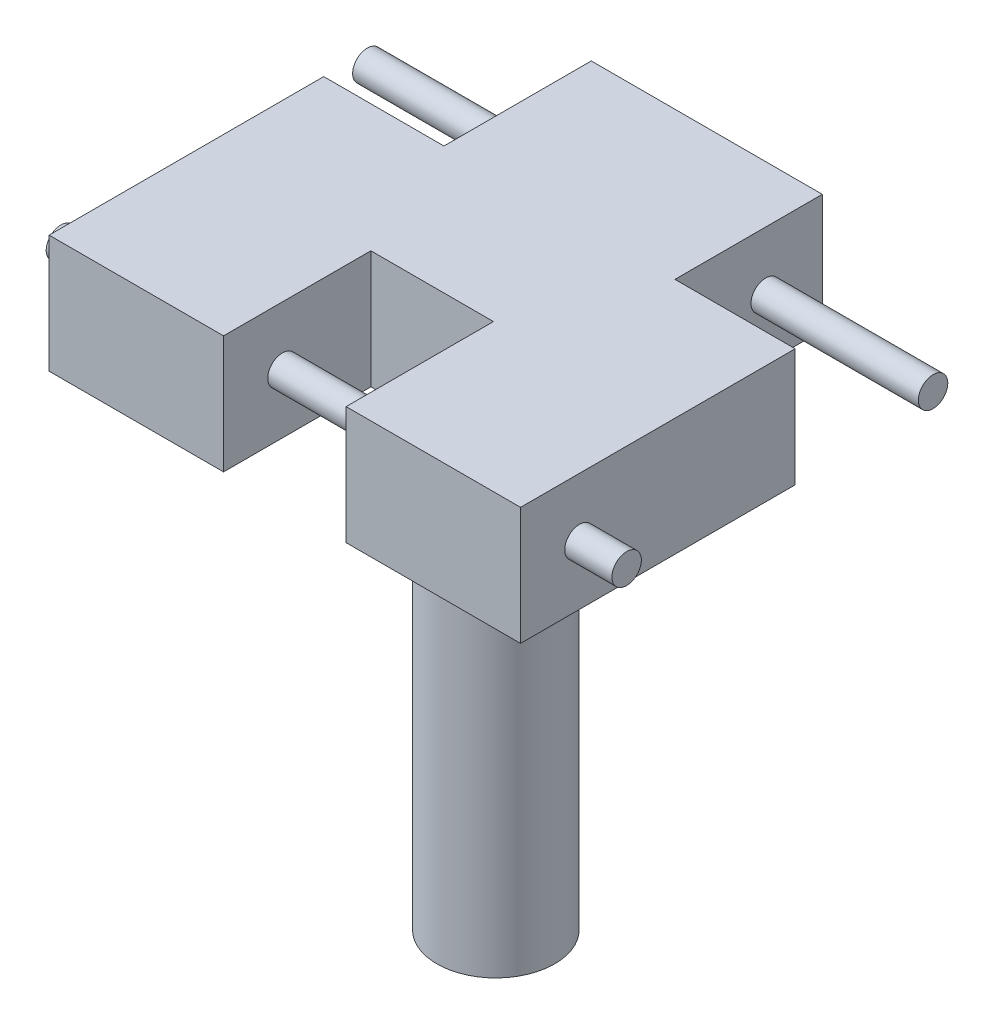
ISO-10303-21;
HEADER;
FILE_DESCRIPTION(('STEP AP214'),'2;1');
FILE_NAME('part.step','',(''),(''),'','','');
FILE_SCHEMA(('AUTOMOTIVE_DESIGN { 1 0 10303 214 1 1 1 1 }'));
ENDSEC;
DATA;
#1=APPLICATION_CONTEXT('core data for automotive mechanical design processes');
#2=APPLICATION_PROTOCOL_DEFINITION('international standard','automotive_design',2000,#1);
#3=PRODUCT_CONTEXT('',#1,'mechanical');
#4=PRODUCT('Part','Part','',(#3));
#5=PRODUCT_RELATED_PRODUCT_CATEGORY('part','',(#4));
#6=PRODUCT_DEFINITION_FORMATION('','',#4);
#7=PRODUCT_DEFINITION_CONTEXT('part definition',#1,'design');
#8=PRODUCT_DEFINITION('design','',#6,#7);
#9=PRODUCT_DEFINITION_SHAPE('','',#8);
#10=(LENGTH_UNIT() NAMED_UNIT(*) SI_UNIT(.MILLI.,.METRE.));
#11=(NAMED_UNIT(*) PLANE_ANGLE_UNIT() SI_UNIT($,.RADIAN.));
#12=(NAMED_UNIT(*) SI_UNIT($,.STERADIAN.) SOLID_ANGLE_UNIT());
#13=UNCERTAINTY_MEASURE_WITH_UNIT(LENGTH_MEASURE(1.E-05),#10,'distance_accuracy_value','');
#14=(GEOMETRIC_REPRESENTATION_CONTEXT(3) GLOBAL_UNCERTAINTY_ASSIGNED_CONTEXT((#13)) GLOBAL_UNIT_ASSIGNED_CONTEXT((#10,
#11,#12)) REPRESENTATION_CONTEXT('',''));
#15=CARTESIAN_POINT('',(0.,0.,0.));
#16=DIRECTION('',(0.,0.,1.));
#17=DIRECTION('',(1.,0.,0.));
#18=AXIS2_PLACEMENT_3D('',#15,#16,#17);
#19=CARTESIAN_POINT('',(-6.223,6.35,1.7145));
#20=DIRECTION('',(1.,0.,0.));
#21=DIRECTION('',(0.,0.,-1.));
#22=AXIS2_PLACEMENT_3D('',#19,#20,#21);
#23=PLANE('',#22);
#24=CARTESIAN_POINT('',(-6.223,3.175,-3.17499999999999));
#25=DIRECTION('',(1.,0.,0.));
#26=DIRECTION('',(0.,0.,-1.));
#27=AXIS2_PLACEMENT_3D('',#24,#25,#26);
#28=CIRCLE('',#27,0.79375);
#29=CARTESIAN_POINT('',(-6.223,3.175,-3.96874999999999));
#30=VERTEX_POINT('',#29);
#31=EDGE_CURVE('E218',#30,#30,#28,.T.);
#32=ORIENTED_EDGE('',*,*,#31,.T.);
#33=EDGE_LOOP('',(#32));
#34=FACE_BOUND('',#33,.T.);
#35=DIRECTION('',(0.,0.,1.));
#36=VECTOR('',#35,1.);
#37=CARTESIAN_POINT('',(-6.223,0.,1.7145));
#38=LINE('',#37,#36);
#39=CARTESIAN_POINT('',(-6.223,0.,-6.223));
#40=VERTEX_POINT('',#39);
#41=CARTESIAN_POINT('',(-6.223,0.,1.7145));
#42=VERTEX_POINT('',#41);
#43=EDGE_CURVE('E157',#40,#42,#38,.T.);
#44=ORIENTED_EDGE('',*,*,#43,.T.);
#45=DIRECTION('',(0.,-1.,0.));
#46=VECTOR('',#45,1.);
#47=CARTESIAN_POINT('',(-6.223,6.35,1.7145));
#48=LINE('',#47,#46);
#49=CARTESIAN_POINT('',(-6.223,6.35,1.7145));
#50=VERTEX_POINT('',#49);
#51=EDGE_CURVE('E11',#50,#42,#48,.T.);
#52=ORIENTED_EDGE('',*,*,#51,.F.);
#53=DIRECTION('',(0.,0.,1.));
#54=VECTOR('',#53,1.);
#55=CARTESIAN_POINT('',(-6.223,6.35,1.7145));
#56=LINE('',#55,#54);
#57=CARTESIAN_POINT('',(-6.223,6.35,-6.223));
#58=VERTEX_POINT('',#57);
#59=EDGE_CURVE('E180',#58,#50,#56,.T.);
#60=ORIENTED_EDGE('',*,*,#59,.F.);
#61=DIRECTION('',(0.,-1.,0.));
#62=VECTOR('',#61,1.);
#63=CARTESIAN_POINT('',(-6.223,6.35,-6.223));
#64=LINE('',#63,#62);
#65=EDGE_CURVE('E153',#58,#40,#64,.T.);
#66=ORIENTED_EDGE('',*,*,#65,.T.);
#67=EDGE_LOOP('',(#44,#52,#60,#66));
#68=FACE_BOUND('',#67,.T.);
#69=ADVANCED_FACE('F35',(#34,#68),#23,.F.);
#70=CARTESIAN_POINT('',(-12.7,6.35,1.7145));
#71=DIRECTION('',(0.,0.,1.));
#72=DIRECTION('',(1.,0.,0.));
#73=AXIS2_PLACEMENT_3D('',#70,#71,#72);
#74=PLANE('',#73);
#75=DIRECTION('',(-1.,0.,0.));
#76=VECTOR('',#75,1.);
#77=CARTESIAN_POINT('',(-12.7,0.,1.7145));
#78=LINE('',#77,#76);
#79=CARTESIAN_POINT('',(-12.7,0.,1.7145));
#80=VERTEX_POINT('',#79);
#81=EDGE_CURVE('E160',#42,#80,#78,.T.);
#82=ORIENTED_EDGE('',*,*,#81,.T.);
#83=DIRECTION('',(0.,-1.,0.));
#84=VECTOR('',#83,1.);
#85=CARTESIAN_POINT('',(-12.7,6.35,1.7145));
#86=LINE('',#85,#84);
#87=CARTESIAN_POINT('',(-12.7,6.35,1.7145));
#88=VERTEX_POINT('',#87);
#89=EDGE_CURVE('E44',#88,#80,#86,.T.);
#90=ORIENTED_EDGE('',*,*,#89,.F.);
#91=DIRECTION('',(-1.,0.,0.));
#92=VECTOR('',#91,1.);
#93=CARTESIAN_POINT('',(-12.7,6.35,1.7145));
#94=LINE('',#93,#92);
#95=EDGE_CURVE('E108',#50,#88,#94,.T.);
#96=ORIENTED_EDGE('',*,*,#95,.F.);
#97=ORIENTED_EDGE('',*,*,#51,.T.);
#98=EDGE_LOOP('',(#82,#90,#96,#97));
#99=FACE_BOUND('',#98,.T.);
#100=ADVANCED_FACE('F268',(#99),#74,.F.);
#101=CARTESIAN_POINT('',(-12.7,6.35,16.51));
#102=DIRECTION('',(1.,0.,0.));
#103=DIRECTION('',(0.,0.,-1.));
#104=AXIS2_PLACEMENT_3D('',#101,#102,#103);
#105=PLANE('',#104);
#106=CARTESIAN_POINT('',(-12.7,3.175,13.335));
#107=DIRECTION('',(1.,0.,0.));
#108=DIRECTION('',(0.,0.,-1.));
#109=AXIS2_PLACEMENT_3D('',#106,#107,#108);
#110=CIRCLE('',#109,0.793749999999999);
#111=CARTESIAN_POINT('',(-12.7,3.175,12.54125));
#112=VERTEX_POINT('',#111);
#113=EDGE_CURVE('E161',#112,#112,#110,.T.);
#114=ORIENTED_EDGE('',*,*,#113,.T.);
#115=EDGE_LOOP('',(#114));
#116=FACE_BOUND('',#115,.T.);
#117=DIRECTION('',(0.,0.,1.));
#118=VECTOR('',#117,1.);
#119=CARTESIAN_POINT('',(-12.7,0.,16.51));
#120=LINE('',#119,#118);
#121=CARTESIAN_POINT('',(-12.7,0.,16.51));
#122=VERTEX_POINT('',#121);
#123=EDGE_CURVE('E163',#80,#122,#120,.T.);
#124=ORIENTED_EDGE('',*,*,#123,.T.);
#125=DIRECTION('',(0.,-1.,0.));
#126=VECTOR('',#125,1.);
#127=CARTESIAN_POINT('',(-12.7,6.35,16.51));
#128=LINE('',#127,#126);
#129=CARTESIAN_POINT('',(-12.7,6.35,16.51));
#130=VERTEX_POINT('',#129);
#131=EDGE_CURVE('E199',#130,#122,#128,.T.);
#132=ORIENTED_EDGE('',*,*,#131,.F.);
#133=DIRECTION('',(0.,0.,1.));
#134=VECTOR('',#133,1.);
#135=CARTESIAN_POINT('',(-12.7,6.35,16.51));
#136=LINE('',#135,#134);
#137=EDGE_CURVE('E228',#88,#130,#136,.T.);
#138=ORIENTED_EDGE('',*,*,#137,.F.);
#139=ORIENTED_EDGE('',*,*,#89,.T.);
#140=EDGE_LOOP('',(#124,#132,#138,#139));
#141=FACE_BOUND('',#140,.T.);
#142=ADVANCED_FACE('F273',(#116,#141),#105,.F.);
#143=CARTESIAN_POINT('',(-3.302,6.35,16.51));
#144=DIRECTION('',(0.,0.,-1.));
#145=DIRECTION('',(-1.,0.,0.));
#146=AXIS2_PLACEMENT_3D('',#143,#144,#145);
#147=PLANE('',#146);
#148=DIRECTION('',(1.,0.,0.));
#149=VECTOR('',#148,1.);
#150=CARTESIAN_POINT('',(-3.302,0.,16.51));
#151=LINE('',#150,#149);
#152=CARTESIAN_POINT('',(-3.302,0.,16.51));
#153=VERTEX_POINT('',#152);
#154=EDGE_CURVE('E165',#122,#153,#151,.T.);
#155=ORIENTED_EDGE('',*,*,#154,.T.);
#156=DIRECTION('',(0.,-1.,0.));
#157=VECTOR('',#156,1.);
#158=CARTESIAN_POINT('',(-3.302,6.35,16.51));
#159=LINE('',#158,#157);
#160=CARTESIAN_POINT('',(-3.302,6.35,16.51));
#161=VERTEX_POINT('',#160);
#162=EDGE_CURVE('E196',#161,#153,#159,.T.);
#163=ORIENTED_EDGE('',*,*,#162,.F.);
#164=DIRECTION('',(1.,0.,0.));
#165=VECTOR('',#164,1.);
#166=CARTESIAN_POINT('',(-3.302,6.35,16.51));
#167=LINE('',#166,#165);
#168=EDGE_CURVE('E230',#130,#161,#167,.T.);
#169=ORIENTED_EDGE('',*,*,#168,.F.);
#170=ORIENTED_EDGE('',*,*,#131,.T.);
#171=EDGE_LOOP('',(#155,#163,#169,#170));
#172=FACE_BOUND('',#171,.T.);
#173=ADVANCED_FACE('F422',(#172),#147,.F.);
#174=CARTESIAN_POINT('',(-3.302,6.35,8.5725));
#175=DIRECTION('',(-1.,0.,0.));
#176=DIRECTION('',(0.,0.,1.));
#177=AXIS2_PLACEMENT_3D('',#174,#175,#176);
#178=PLANE('',#177);
#179=CARTESIAN_POINT('',(-3.302,3.175,13.335));
#180=DIRECTION('',(-1.,0.,0.));
#181=DIRECTION('',(0.,0.,1.));
#182=AXIS2_PLACEMENT_3D('',#179,#180,#181);
#183=CIRCLE('',#182,0.793749999999999);
#184=CARTESIAN_POINT('',(-3.302,3.175,14.12875));
#185=VERTEX_POINT('',#184);
#186=EDGE_CURVE('E210',#185,#185,#183,.T.);
#187=ORIENTED_EDGE('',*,*,#186,.T.);
#188=EDGE_LOOP('',(#187));
#189=FACE_BOUND('',#188,.T.);
#190=DIRECTION('',(0.,0.,-1.));
#191=VECTOR('',#190,1.);
#192=CARTESIAN_POINT('',(-3.302,0.,8.5725));
#193=LINE('',#192,#191);
#194=CARTESIAN_POINT('',(-3.302,0.,8.5725));
#195=VERTEX_POINT('',#194);
#196=EDGE_CURVE('E167',#153,#195,#193,.T.);
#197=ORIENTED_EDGE('',*,*,#196,.T.);
#198=DIRECTION('',(0.,-1.,0.));
#199=VECTOR('',#198,1.);
#200=CARTESIAN_POINT('',(-3.302,6.35,8.5725));
#201=LINE('',#200,#199);
#202=CARTESIAN_POINT('',(-3.302,6.35,8.5725));
#203=VERTEX_POINT('',#202);
#204=EDGE_CURVE('E193',#203,#195,#201,.T.);
#205=ORIENTED_EDGE('',*,*,#204,.F.);
#206=DIRECTION('',(0.,0.,-1.));
#207=VECTOR('',#206,1.);
#208=CARTESIAN_POINT('',(-3.302,6.35,8.5725));
#209=LINE('',#208,#207);
#210=EDGE_CURVE('E232',#161,#203,#209,.T.);
#211=ORIENTED_EDGE('',*,*,#210,.F.);
#212=ORIENTED_EDGE('',*,*,#162,.T.);
#213=EDGE_LOOP('',(#197,#205,#211,#212));
#214=FACE_BOUND('',#213,.T.);
#215=ADVANCED_FACE('F417',(#189,#214),#178,.F.);
#216=CARTESIAN_POINT('',(3.302,6.35,8.5725));
#217=DIRECTION('',(0.,0.,-1.));
#218=DIRECTION('',(-1.,0.,0.));
#219=AXIS2_PLACEMENT_3D('',#216,#217,#218);
#220=PLANE('',#219);
#221=DIRECTION('',(1.,0.,0.));
#222=VECTOR('',#221,1.);
#223=CARTESIAN_POINT('',(3.302,0.,8.5725));
#224=LINE('',#223,#222);
#225=CARTESIAN_POINT('',(3.302,0.,8.5725));
#226=VERTEX_POINT('',#225);
#227=EDGE_CURVE('E169',#195,#226,#224,.T.);
#228=ORIENTED_EDGE('',*,*,#227,.T.);
#229=DIRECTION('',(0.,-1.,0.));
#230=VECTOR('',#229,1.);
#231=CARTESIAN_POINT('',(3.302,6.35,8.5725));
#232=LINE('',#231,#230);
#233=CARTESIAN_POINT('',(3.302,6.35,8.5725));
#234=VERTEX_POINT('',#233);
#235=EDGE_CURVE('E190',#234,#226,#232,.T.);
#236=ORIENTED_EDGE('',*,*,#235,.F.);
#237=DIRECTION('',(1.,0.,0.));
#238=VECTOR('',#237,1.);
#239=CARTESIAN_POINT('',(3.302,6.35,8.5725));
#240=LINE('',#239,#238);
#241=EDGE_CURVE('E234',#203,#234,#240,.T.);
#242=ORIENTED_EDGE('',*,*,#241,.F.);
#243=ORIENTED_EDGE('',*,*,#204,.T.);
#244=EDGE_LOOP('',(#228,#236,#242,#243));
#245=FACE_BOUND('',#244,.T.);
#246=ADVANCED_FACE('F409',(#245),#220,.F.);
#247=CARTESIAN_POINT('',(3.302,6.35,16.51));
#248=DIRECTION('',(1.,0.,0.));
#249=DIRECTION('',(0.,0.,-1.));
#250=AXIS2_PLACEMENT_3D('',#247,#248,#249);
#251=PLANE('',#250);
#252=CARTESIAN_POINT('',(3.302,3.175,13.335));
#253=DIRECTION('',(1.,0.,0.));
#254=DIRECTION('',(0.,0.,-1.));
#255=AXIS2_PLACEMENT_3D('',#252,#253,#254);
#256=CIRCLE('',#255,0.793749999999999);
#257=CARTESIAN_POINT('',(3.302,3.175,12.54125));
#258=VERTEX_POINT('',#257);
#259=EDGE_CURVE('E205',#258,#258,#256,.T.);
#260=ORIENTED_EDGE('',*,*,#259,.T.);
#261=EDGE_LOOP('',(#260));
#262=FACE_BOUND('',#261,.T.);
#263=DIRECTION('',(0.,0.,1.));
#264=VECTOR('',#263,1.);
#265=CARTESIAN_POINT('',(3.302,0.,16.51));
#266=LINE('',#265,#264);
#267=CARTESIAN_POINT('',(3.302,0.,16.51));
#268=VERTEX_POINT('',#267);
#269=EDGE_CURVE('E171',#226,#268,#266,.T.);
#270=ORIENTED_EDGE('',*,*,#269,.T.);
#271=DIRECTION('',(0.,-1.,0.));
#272=VECTOR('',#271,1.);
#273=CARTESIAN_POINT('',(3.302,6.35,16.51));
#274=LINE('',#273,#272);
#275=CARTESIAN_POINT('',(3.302,6.35,16.51));
#276=VERTEX_POINT('',#275);
#277=EDGE_CURVE('E187',#276,#268,#274,.T.);
#278=ORIENTED_EDGE('',*,*,#277,.F.);
#279=DIRECTION('',(0.,0.,1.));
#280=VECTOR('',#279,1.);
#281=CARTESIAN_POINT('',(3.302,6.35,16.51));
#282=LINE('',#281,#280);
#283=EDGE_CURVE('E236',#234,#276,#282,.T.);
#284=ORIENTED_EDGE('',*,*,#283,.F.);
#285=ORIENTED_EDGE('',*,*,#235,.T.);
#286=EDGE_LOOP('',(#270,#278,#284,#285));
#287=FACE_BOUND('',#286,.T.);
#288=ADVANCED_FACE('F404',(#262,#287),#251,.F.);
#289=CARTESIAN_POINT('',(12.7,6.35,16.51));
#290=DIRECTION('',(0.,0.,-1.));
#291=DIRECTION('',(-1.,0.,0.));
#292=AXIS2_PLACEMENT_3D('',#289,#290,#291);
#293=PLANE('',#292);
#294=DIRECTION('',(1.,0.,0.));
#295=VECTOR('',#294,1.);
#296=CARTESIAN_POINT('',(12.7,0.,16.51));
#297=LINE('',#296,#295);
#298=CARTESIAN_POINT('',(12.7,0.,16.51));
#299=VERTEX_POINT('',#298);
#300=EDGE_CURVE('E173',#268,#299,#297,.T.);
#301=ORIENTED_EDGE('',*,*,#300,.T.);
#302=DIRECTION('',(0.,-1.,0.));
#303=VECTOR('',#302,1.);
#304=CARTESIAN_POINT('',(12.7,6.35,16.51));
#305=LINE('',#304,#303);
#306=CARTESIAN_POINT('',(12.7,6.35,16.51));
#307=VERTEX_POINT('',#306);
#308=EDGE_CURVE('E184',#307,#299,#305,.T.);
#309=ORIENTED_EDGE('',*,*,#308,.F.);
#310=DIRECTION('',(1.,0.,0.));
#311=VECTOR('',#310,1.);
#312=CARTESIAN_POINT('',(12.7,6.35,16.51));
#313=LINE('',#312,#311);
#314=EDGE_CURVE('E238',#276,#307,#313,.T.);
#315=ORIENTED_EDGE('',*,*,#314,.F.);
#316=ORIENTED_EDGE('',*,*,#277,.T.);
#317=EDGE_LOOP('',(#301,#309,#315,#316));
#318=FACE_BOUND('',#317,.T.);
#319=ADVANCED_FACE('F244',(#318),#293,.F.);
#320=CARTESIAN_POINT('',(12.7,6.35,1.7145));
#321=DIRECTION('',(-1.,0.,0.));
#322=DIRECTION('',(0.,0.,1.));
#323=AXIS2_PLACEMENT_3D('',#320,#321,#322);
#324=PLANE('',#323);
#325=CARTESIAN_POINT('',(12.7,3.175,13.335));
#326=DIRECTION('',(-1.,0.,0.));
#327=DIRECTION('',(0.,0.,1.));
#328=AXIS2_PLACEMENT_3D('',#325,#326,#327);
#329=CIRCLE('',#328,0.793749999999999);
#330=CARTESIAN_POINT('',(12.7,3.175,14.12875));
#331=VERTEX_POINT('',#330);
#332=EDGE_CURVE('E203',#331,#331,#329,.T.);
#333=ORIENTED_EDGE('',*,*,#332,.T.);
#334=EDGE_LOOP('',(#333));
#335=FACE_BOUND('',#334,.T.);
#336=DIRECTION('',(0.,0.,-1.));
#337=VECTOR('',#336,1.);
#338=CARTESIAN_POINT('',(12.7,0.,1.7145));
#339=LINE('',#338,#337);
#340=CARTESIAN_POINT('',(12.7,0.,1.7145));
#341=VERTEX_POINT('',#340);
#342=EDGE_CURVE('E175',#299,#341,#339,.T.);
#343=ORIENTED_EDGE('',*,*,#342,.T.);
#344=DIRECTION('',(0.,-1.,0.));
#345=VECTOR('',#344,1.);
#346=CARTESIAN_POINT('',(12.7,6.35,1.7145));
#347=LINE('',#346,#345);
#348=CARTESIAN_POINT('',(12.7,6.35,1.7145));
#349=VERTEX_POINT('',#348);
#350=EDGE_CURVE('E148',#349,#341,#347,.T.);
#351=ORIENTED_EDGE('',*,*,#350,.F.);
#352=DIRECTION('',(0.,0.,-1.));
#353=VECTOR('',#352,1.);
#354=CARTESIAN_POINT('',(12.7,6.35,1.7145));
#355=LINE('',#354,#353);
#356=EDGE_CURVE('E139',#307,#349,#355,.T.);
#357=ORIENTED_EDGE('',*,*,#356,.F.);
#358=ORIENTED_EDGE('',*,*,#308,.T.);
#359=EDGE_LOOP('',(#343,#351,#357,#358));
#360=FACE_BOUND('',#359,.T.);
#361=ADVANCED_FACE('F248',(#335,#360),#324,.F.);
#362=CARTESIAN_POINT('',(6.223,6.35,1.7145));
#363=DIRECTION('',(0.,0.,1.));
#364=DIRECTION('',(1.,0.,0.));
#365=AXIS2_PLACEMENT_3D('',#362,#363,#364);
#366=PLANE('',#365);
#367=DIRECTION('',(-1.,0.,0.));
#368=VECTOR('',#367,1.);
#369=CARTESIAN_POINT('',(6.223,0.,1.7145));
#370=LINE('',#369,#368);
#371=CARTESIAN_POINT('',(6.223,0.,1.7145));
#372=VERTEX_POINT('',#371);
#373=EDGE_CURVE('E147',#341,#372,#370,.T.);
#374=ORIENTED_EDGE('',*,*,#373,.T.);
#375=DIRECTION('',(0.,-1.,0.));
#376=VECTOR('',#375,1.);
#377=CARTESIAN_POINT('',(6.223,6.35,1.7145));
#378=LINE('',#377,#376);
#379=CARTESIAN_POINT('',(6.223,6.35,1.7145));
#380=VERTEX_POINT('',#379);
#381=EDGE_CURVE('E144',#380,#372,#378,.T.);
#382=ORIENTED_EDGE('',*,*,#381,.F.);
#383=DIRECTION('',(-1.,0.,0.));
#384=VECTOR('',#383,1.);
#385=CARTESIAN_POINT('',(6.223,6.35,1.7145));
#386=LINE('',#385,#384);
#387=EDGE_CURVE('E133',#349,#380,#386,.T.);
#388=ORIENTED_EDGE('',*,*,#387,.F.);
#389=ORIENTED_EDGE('',*,*,#350,.T.);
#390=EDGE_LOOP('',(#374,#382,#388,#389));
#391=FACE_BOUND('',#390,.T.);
#392=ADVANCED_FACE('F145',(#391),#366,.F.);
#393=CARTESIAN_POINT('',(6.223,6.35,-6.223));
#394=DIRECTION('',(-1.,0.,0.));
#395=DIRECTION('',(0.,0.,1.));
#396=AXIS2_PLACEMENT_3D('',#393,#394,#395);
#397=PLANE('',#396);
#398=CARTESIAN_POINT('',(6.223,3.175,-3.175));
#399=DIRECTION('',(-1.,0.,0.));
#400=DIRECTION('',(0.,0.,1.));
#401=AXIS2_PLACEMENT_3D('',#398,#399,#400);
#402=CIRCLE('',#401,0.79375);
#403=CARTESIAN_POINT('',(6.223,3.175,-2.38125));
#404=VERTEX_POINT('',#403);
#405=EDGE_CURVE('E38',#404,#404,#402,.T.);
#406=ORIENTED_EDGE('',*,*,#405,.T.);
#407=EDGE_LOOP('',(#406));
#408=FACE_BOUND('',#407,.T.);
#409=DIRECTION('',(0.,0.,-1.));
#410=VECTOR('',#409,1.);
#411=CARTESIAN_POINT('',(6.223,0.,-6.223));
#412=LINE('',#411,#410);
#413=CARTESIAN_POINT('',(6.223,0.,-6.223));
#414=VERTEX_POINT('',#413);
#415=EDGE_CURVE('E94',#372,#414,#412,.T.);
#416=ORIENTED_EDGE('',*,*,#415,.T.);
#417=DIRECTION('',(0.,-1.,0.));
#418=VECTOR('',#417,1.);
#419=CARTESIAN_POINT('',(6.223,6.35,-6.223));
#420=LINE('',#419,#418);
#421=CARTESIAN_POINT('',(6.223,6.35,-6.223));
#422=VERTEX_POINT('',#421);
#423=EDGE_CURVE('E149',#422,#414,#420,.T.);
#424=ORIENTED_EDGE('',*,*,#423,.F.);
#425=DIRECTION('',(0.,0.,-1.));
#426=VECTOR('',#425,1.);
#427=CARTESIAN_POINT('',(6.223,6.35,-6.223));
#428=LINE('',#427,#426);
#429=EDGE_CURVE('E137',#380,#422,#428,.T.);
#430=ORIENTED_EDGE('',*,*,#429,.F.);
#431=ORIENTED_EDGE('',*,*,#381,.T.);
#432=EDGE_LOOP('',(#416,#424,#430,#431));
#433=FACE_BOUND('',#432,.T.);
#434=ADVANCED_FACE('F151',(#408,#433),#397,.F.);
#435=CARTESIAN_POINT('',(-6.223,6.35,-6.223));
#436=DIRECTION('',(0.,0.,1.));
#437=DIRECTION('',(1.,0.,0.));
#438=AXIS2_PLACEMENT_3D('',#435,#436,#437);
#439=PLANE('',#438);
#440=DIRECTION('',(-1.,0.,0.));
#441=VECTOR('',#440,1.);
#442=CARTESIAN_POINT('',(-6.223,0.,-6.223));
#443=LINE('',#442,#441);
#444=EDGE_CURVE('E100',#414,#40,#443,.T.);
#445=ORIENTED_EDGE('',*,*,#444,.T.);
#446=ORIENTED_EDGE('',*,*,#65,.F.);
#447=DIRECTION('',(-1.,0.,0.));
#448=VECTOR('',#447,1.);
#449=CARTESIAN_POINT('',(-6.223,6.35,-6.223));
#450=LINE('',#449,#448);
#451=EDGE_CURVE('E53',#422,#58,#450,.T.);
#452=ORIENTED_EDGE('',*,*,#451,.F.);
#453=ORIENTED_EDGE('',*,*,#423,.T.);
#454=EDGE_LOOP('',(#445,#446,#452,#453));
#455=FACE_BOUND('',#454,.T.);
#456=ADVANCED_FACE('F256',(#455),#439,.F.);
#457=CARTESIAN_POINT('',(0.,6.35,0.));
#458=DIRECTION('',(0.,-1.,0.));
#459=DIRECTION('',(0.,0.,-1.));
#460=AXIS2_PLACEMENT_3D('',#457,#458,#459);
#461=PLANE('',#460);
#462=ORIENTED_EDGE('',*,*,#59,.T.);
#463=ORIENTED_EDGE('',*,*,#95,.T.);
#464=ORIENTED_EDGE('',*,*,#137,.T.);
#465=ORIENTED_EDGE('',*,*,#168,.T.);
#466=ORIENTED_EDGE('',*,*,#210,.T.);
#467=ORIENTED_EDGE('',*,*,#241,.T.);
#468=ORIENTED_EDGE('',*,*,#283,.T.);
#469=ORIENTED_EDGE('',*,*,#314,.T.);
#470=ORIENTED_EDGE('',*,*,#356,.T.);
#471=ORIENTED_EDGE('',*,*,#387,.T.);
#472=ORIENTED_EDGE('',*,*,#429,.T.);
#473=ORIENTED_EDGE('',*,*,#451,.T.);
#474=EDGE_LOOP('',(#462,#463,#464,#465,#466,#467,#468,#469,#470,#471,#472,#473));
#475=FACE_BOUND('',#474,.T.);
#476=ADVANCED_FACE('F135',(#475),#461,.F.);
#477=CARTESIAN_POINT('',(0.,0.,0.));
#478=DIRECTION('',(0.,-1.,0.));
#479=DIRECTION('',(0.,0.,-1.));
#480=AXIS2_PLACEMENT_3D('',#477,#478,#479);
#481=PLANE('',#480);
#482=CARTESIAN_POINT('',(0.,0.,5.1435));
#483=DIRECTION('',(0.,-1.,0.));
#484=DIRECTION('',(0.,0.,-1.));
#485=AXIS2_PLACEMENT_3D('',#482,#483,#484);
#486=CIRCLE('',#485,3.175);
#487=CARTESIAN_POINT('',(0.,0.,1.9685));
#488=VERTEX_POINT('',#487);
#489=EDGE_CURVE('E286',#488,#488,#486,.T.);
#490=ORIENTED_EDGE('',*,*,#489,.F.);
#491=EDGE_LOOP('',(#490));
#492=FACE_BOUND('',#491,.T.);
#493=ORIENTED_EDGE('',*,*,#43,.F.);
#494=ORIENTED_EDGE('',*,*,#444,.F.);
#495=ORIENTED_EDGE('',*,*,#415,.F.);
#496=ORIENTED_EDGE('',*,*,#373,.F.);
#497=ORIENTED_EDGE('',*,*,#342,.F.);
#498=ORIENTED_EDGE('',*,*,#300,.F.);
#499=ORIENTED_EDGE('',*,*,#269,.F.);
#500=ORIENTED_EDGE('',*,*,#227,.F.);
#501=ORIENTED_EDGE('',*,*,#196,.F.);
#502=ORIENTED_EDGE('',*,*,#154,.F.);
#503=ORIENTED_EDGE('',*,*,#123,.F.);
#504=ORIENTED_EDGE('',*,*,#81,.F.);
#505=EDGE_LOOP('',(#493,#494,#495,#496,#497,#498,#499,#500,#501,#502,#503,#504));
#506=FACE_BOUND('',#505,.T.);
#507=ADVANCED_FACE('F251',(#492,#506),#481,.T.);
#508=CARTESIAN_POINT('',(15.24,3.175,13.335));
#509=DIRECTION('',(1.,0.,0.));
#510=DIRECTION('',(0.,0.,-1.));
#511=AXIS2_PLACEMENT_3D('',#508,#509,#510);
#512=PLANE('',#511);
#513=CARTESIAN_POINT('',(15.24,3.175,13.335));
#514=DIRECTION('',(1.,0.,0.));
#515=DIRECTION('',(0.,0.,-1.));
#516=AXIS2_PLACEMENT_3D('',#513,#514,#515);
#517=CIRCLE('',#516,0.793749999999999);
#518=CARTESIAN_POINT('',(15.24,3.175,12.54125));
#519=VERTEX_POINT('',#518);
#520=EDGE_CURVE('E213',#519,#519,#517,.T.);
#521=ORIENTED_EDGE('',*,*,#520,.T.);
#522=EDGE_LOOP('',(#521));
#523=FACE_BOUND('',#522,.T.);
#524=ADVANCED_FACE('F302',(#523),#512,.T.);
#525=CARTESIAN_POINT('',(-15.24,3.175,13.335));
#526=DIRECTION('',(1.,0.,0.));
#527=DIRECTION('',(0.,0.,-1.));
#528=AXIS2_PLACEMENT_3D('',#525,#526,#527);
#529=CYLINDRICAL_SURFACE('',#528,0.793749999999999);
#530=ORIENTED_EDGE('',*,*,#520,.F.);
#531=EDGE_LOOP('',(#530));
#532=FACE_BOUND('',#531,.T.);
#533=ORIENTED_EDGE('',*,*,#332,.F.);
#534=EDGE_LOOP('',(#533));
#535=FACE_BOUND('',#534,.T.);
#536=ADVANCED_FACE('F306',(#532,#535),#529,.T.);
#537=ORIENTED_EDGE('',*,*,#259,.F.);
#538=EDGE_LOOP('',(#537));
#539=FACE_BOUND('',#538,.T.);
#540=ORIENTED_EDGE('',*,*,#186,.F.);
#541=EDGE_LOOP('',(#540));
#542=FACE_BOUND('',#541,.T.);
#543=ADVANCED_FACE('F314',(#539,#542),#529,.T.);
#544=CARTESIAN_POINT('',(-15.24,3.175,13.335));
#545=DIRECTION('',(1.,0.,0.));
#546=DIRECTION('',(0.,0.,-1.));
#547=AXIS2_PLACEMENT_3D('',#544,#545,#546);
#548=CIRCLE('',#547,0.793749999999999);
#549=CARTESIAN_POINT('',(-15.24,3.175,12.54125));
#550=VERTEX_POINT('',#549);
#551=EDGE_CURVE('E206',#550,#550,#548,.T.);
#552=ORIENTED_EDGE('',*,*,#551,.T.);
#553=EDGE_LOOP('',(#552));
#554=FACE_BOUND('',#553,.T.);
#555=ORIENTED_EDGE('',*,*,#113,.F.);
#556=EDGE_LOOP('',(#555));
#557=FACE_BOUND('',#556,.T.);
#558=ADVANCED_FACE('F310',(#554,#557),#529,.T.);
#559=CARTESIAN_POINT('',(-15.24,3.175,13.335));
#560=DIRECTION('',(1.,0.,0.));
#561=DIRECTION('',(0.,0.,-1.));
#562=AXIS2_PLACEMENT_3D('',#559,#560,#561);
#563=PLANE('',#562);
#564=ORIENTED_EDGE('',*,*,#551,.F.);
#565=EDGE_LOOP('',(#564));
#566=FACE_BOUND('',#565,.T.);
#567=ADVANCED_FACE('F313',(#566),#563,.F.);
#568=CARTESIAN_POINT('',(15.24,3.175,-3.175));
#569=DIRECTION('',(1.,0.,0.));
#570=DIRECTION('',(0.,0.,-1.));
#571=AXIS2_PLACEMENT_3D('',#568,#569,#570);
#572=PLANE('',#571);
#573=CARTESIAN_POINT('',(15.24,3.175,-3.175));
#574=DIRECTION('',(1.,0.,0.));
#575=DIRECTION('',(0.,0.,-1.));
#576=AXIS2_PLACEMENT_3D('',#573,#574,#575);
#577=CIRCLE('',#576,0.79375);
#578=CARTESIAN_POINT('',(15.24,3.175,-3.96875));
#579=VERTEX_POINT('',#578);
#580=EDGE_CURVE('E282',#579,#579,#577,.T.);
#581=ORIENTED_EDGE('',*,*,#580,.T.);
#582=EDGE_LOOP('',(#581));
#583=FACE_BOUND('',#582,.T.);
#584=ADVANCED_FACE('F316',(#583),#572,.T.);
#585=CARTESIAN_POINT('',(-15.24,3.175,-3.17499999999999));
#586=DIRECTION('',(1.,0.,0.));
#587=DIRECTION('',(0.,0.,-1.));
#588=AXIS2_PLACEMENT_3D('',#585,#586,#587);
#589=CYLINDRICAL_SURFACE('',#588,0.79375);
#590=ORIENTED_EDGE('',*,*,#580,.F.);
#591=EDGE_LOOP('',(#590));
#592=FACE_BOUND('',#591,.T.);
#593=ORIENTED_EDGE('',*,*,#405,.F.);
#594=EDGE_LOOP('',(#593));
#595=FACE_BOUND('',#594,.T.);
#596=ADVANCED_FACE('F322',(#592,#595),#589,.T.);
#597=CARTESIAN_POINT('',(-15.24,3.175,-3.17499999999999));
#598=DIRECTION('',(1.,0.,0.));
#599=DIRECTION('',(0.,0.,-1.));
#600=AXIS2_PLACEMENT_3D('',#597,#598,#599);
#601=CIRCLE('',#600,0.79375);
#602=CARTESIAN_POINT('',(-15.24,3.175,-3.96874999999999));
#603=VERTEX_POINT('',#602);
#604=EDGE_CURVE('E278',#603,#603,#601,.T.);
#605=ORIENTED_EDGE('',*,*,#604,.T.);
#606=EDGE_LOOP('',(#605));
#607=FACE_BOUND('',#606,.T.);
#608=ORIENTED_EDGE('',*,*,#31,.F.);
#609=EDGE_LOOP('',(#608));
#610=FACE_BOUND('',#609,.T.);
#611=ADVANCED_FACE('F319',(#607,#610),#589,.T.);
#612=CARTESIAN_POINT('',(-15.24,3.175,-3.17499999999999));
#613=DIRECTION('',(1.,0.,0.));
#614=DIRECTION('',(0.,0.,-1.));
#615=AXIS2_PLACEMENT_3D('',#612,#613,#614);
#616=PLANE('',#615);
#617=ORIENTED_EDGE('',*,*,#604,.F.);
#618=EDGE_LOOP('',(#617));
#619=FACE_BOUND('',#618,.T.);
#620=ADVANCED_FACE('F297',(#619),#616,.F.);
#621=CARTESIAN_POINT('',(0.,-25.4,5.1435));
#622=DIRECTION('',(0.,1.,0.));
#623=DIRECTION('',(0.,0.,1.));
#624=AXIS2_PLACEMENT_3D('',#621,#622,#623);
#625=CYLINDRICAL_SURFACE('',#624,3.175);
#626=CARTESIAN_POINT('',(0.,-25.4,5.1435));
#627=DIRECTION('',(0.,-1.,0.));
#628=DIRECTION('',(0.,0.,-1.));
#629=AXIS2_PLACEMENT_3D('',#626,#627,#628);
#630=CIRCLE('',#629,3.175);
#631=CARTESIAN_POINT('',(0.,-25.4,1.9685));
#632=VERTEX_POINT('',#631);
#633=EDGE_CURVE('E285',#632,#632,#630,.T.);
#634=ORIENTED_EDGE('',*,*,#633,.F.);
#635=EDGE_LOOP('',(#634));
#636=FACE_BOUND('',#635,.T.);
#637=ORIENTED_EDGE('',*,*,#489,.T.);
#638=EDGE_LOOP('',(#637));
#639=FACE_BOUND('',#638,.T.);
#640=ADVANCED_FACE('F294',(#636,#639),#625,.T.);
#641=CARTESIAN_POINT('',(0.,-25.4,5.1435));
#642=DIRECTION('',(0.,-1.,0.));
#643=DIRECTION('',(0.,0.,-1.));
#644=AXIS2_PLACEMENT_3D('',#641,#642,#643);
#645=PLANE('',#644);
#646=ORIENTED_EDGE('',*,*,#633,.T.);
#647=EDGE_LOOP('',(#646));
#648=FACE_BOUND('',#647,.T.);
#649=ADVANCED_FACE('F292',(#648),#645,.T.);
#650=CLOSED_SHELL('',(#69,#100,#142,#173,#215,#246,#288,#319,#361,#392,#434,#456,#476,#507,#524,
#536,#543,#558,#567,#584,#596,#611,#620,#640,#649));
#651=MANIFOLD_SOLID_BREP('B2',#650);
#652=ADVANCED_BREP_SHAPE_REPRESENTATION('',(#18,#651),#14);
#653=SHAPE_DEFINITION_REPRESENTATION(#9,#652);
ENDSEC;
END-ISO-10303-21;
